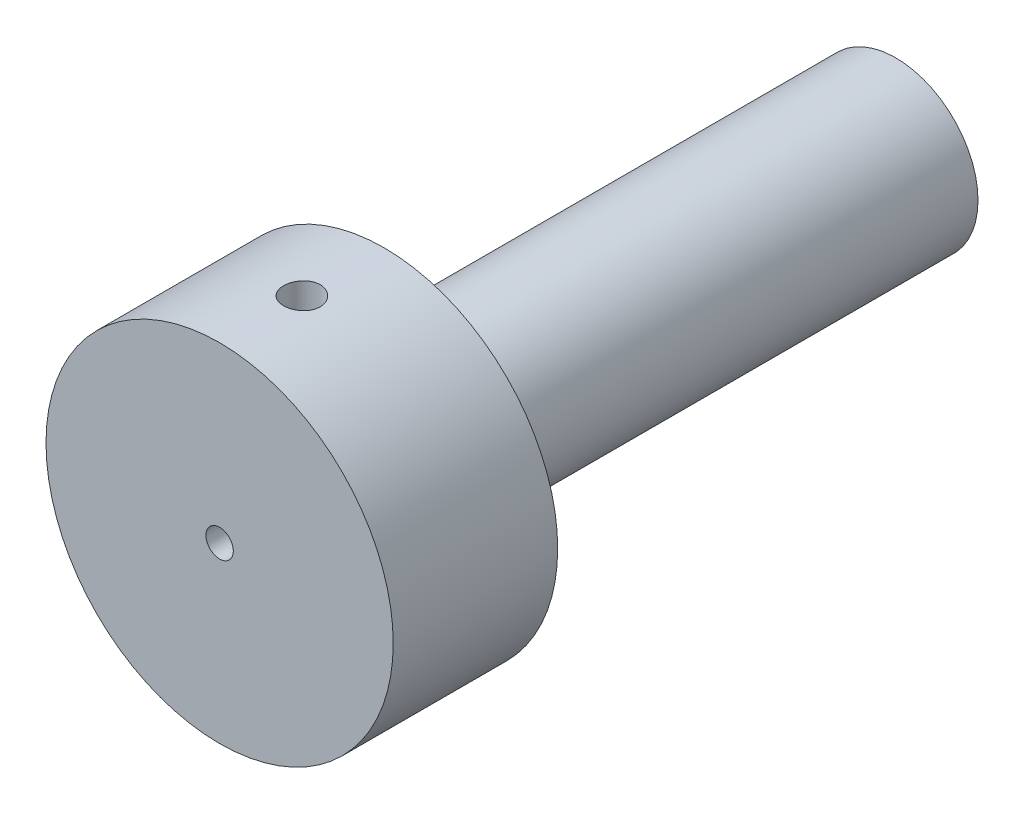
ISO-10303-21;
HEADER;
FILE_DESCRIPTION(('STEP AP214'),'2;1');
FILE_NAME('part.step','',(''),(''),'','','');
FILE_SCHEMA(('AUTOMOTIVE_DESIGN { 1 0 10303 214 1 1 1 1 }'));
ENDSEC;
DATA;
#1=APPLICATION_CONTEXT('core data for automotive mechanical design processes');
#2=APPLICATION_PROTOCOL_DEFINITION('international standard','automotive_design',2000,#1);
#3=PRODUCT_CONTEXT('',#1,'mechanical');
#4=PRODUCT('Part','Part','',(#3));
#5=PRODUCT_RELATED_PRODUCT_CATEGORY('part','',(#4));
#6=PRODUCT_DEFINITION_FORMATION('','',#4);
#7=PRODUCT_DEFINITION_CONTEXT('part definition',#1,'design');
#8=PRODUCT_DEFINITION('design','',#6,#7);
#9=PRODUCT_DEFINITION_SHAPE('','',#8);
#10=(LENGTH_UNIT() NAMED_UNIT(*) SI_UNIT(.MILLI.,.METRE.));
#11=(NAMED_UNIT(*) PLANE_ANGLE_UNIT() SI_UNIT($,.RADIAN.));
#12=(NAMED_UNIT(*) SI_UNIT($,.STERADIAN.) SOLID_ANGLE_UNIT());
#13=UNCERTAINTY_MEASURE_WITH_UNIT(LENGTH_MEASURE(1.E-05),#10,'distance_accuracy_value','');
#14=(GEOMETRIC_REPRESENTATION_CONTEXT(3) GLOBAL_UNCERTAINTY_ASSIGNED_CONTEXT((#13)) GLOBAL_UNIT_ASSIGNED_CONTEXT((#10,
#11,#12)) REPRESENTATION_CONTEXT('',''));
#15=CARTESIAN_POINT('',(0.,0.,0.));
#16=DIRECTION('',(0.,0.,1.));
#17=DIRECTION('',(1.,0.,0.));
#18=AXIS2_PLACEMENT_3D('',#15,#16,#17);
#19=CARTESIAN_POINT('',(-2.22044604925031E-13,19.,56.));
#20=DIRECTION('',(0.,0.,1.));
#21=DIRECTION('',(1.,0.,0.));
#22=AXIS2_PLACEMENT_3D('',#19,#20,#21);
#23=PLANE('',#22);
#24=CARTESIAN_POINT('',(0.,0.,56.));
#25=DIRECTION('',(0.,0.,1.));
#26=DIRECTION('',(1.,0.,0.));
#27=AXIS2_PLACEMENT_3D('',#24,#25,#26);
#28=CIRCLE('',#27,19.);
#29=CARTESIAN_POINT('',(19.,0.,56.));
#30=VERTEX_POINT('',#29);
#31=EDGE_CURVE('E97',#30,#30,#28,.T.);
#32=ORIENTED_EDGE('',*,*,#31,.F.);
#33=EDGE_LOOP('',(#32));
#34=FACE_BOUND('',#33,.T.);
#35=CARTESIAN_POINT('',(0.,0.,56.));
#36=DIRECTION('',(0.,0.,1.));
#37=DIRECTION('',(1.,0.,0.));
#38=AXIS2_PLACEMENT_3D('',#35,#36,#37);
#39=CIRCLE('',#38,12.);
#40=CARTESIAN_POINT('',(12.,0.,56.));
#41=VERTEX_POINT('',#40);
#42=EDGE_CURVE('E100',#41,#41,#39,.T.);
#43=ORIENTED_EDGE('',*,*,#42,.T.);
#44=EDGE_LOOP('',(#43));
#45=FACE_BOUND('',#44,.T.);
#46=CARTESIAN_POINT('',(0.,-15.,56.));
#47=DIRECTION('',(0.,0.,-1.));
#48=DIRECTION('',(-1.,0.,0.));
#49=AXIS2_PLACEMENT_3D('',#46,#47,#48);
#50=CIRCLE('',#49,2.);
#51=CARTESIAN_POINT('',(-2.,-15.,56.));
#52=VERTEX_POINT('',#51);
#53=EDGE_CURVE('E120',#52,#52,#50,.T.);
#54=ORIENTED_EDGE('',*,*,#53,.F.);
#55=EDGE_LOOP('',(#54));
#56=FACE_BOUND('',#55,.T.);
#57=ADVANCED_FACE('F34',(#34,#45,#56),#23,.F.);
#58=CARTESIAN_POINT('',(0.,0.,56.));
#59=DIRECTION('',(0.,0.,1.));
#60=DIRECTION('',(1.,0.,0.));
#61=AXIS2_PLACEMENT_3D('',#58,#59,#60);
#62=CYLINDRICAL_SURFACE('',#61,19.);
#63=ORIENTED_EDGE('',*,*,#31,.T.);
#64=EDGE_LOOP('',(#63));
#65=FACE_BOUND('',#64,.T.);
#66=CARTESIAN_POINT('',(0.,0.,74.));
#67=DIRECTION('',(0.,0.,1.));
#68=DIRECTION('',(1.,0.,0.));
#69=AXIS2_PLACEMENT_3D('',#66,#67,#68);
#70=CIRCLE('',#69,19.);
#71=CARTESIAN_POINT('',(19.,0.,74.));
#72=VERTEX_POINT('',#71);
#73=EDGE_CURVE('E106',#72,#72,#70,.T.);
#74=ORIENTED_EDGE('',*,*,#73,.F.);
#75=EDGE_LOOP('',(#74));
#76=FACE_BOUND('',#75,.T.);
#77=CARTESIAN_POINT('',(-2.22044604925031E-13,19.,63.));
#78=CARTESIAN_POINT('',(-0.11200841784446,18.9999986504858,63.0000048342617));
#79=CARTESIAN_POINT('',(-0.224090111161781,18.9989990230296,63.0094411031933));
#80=CARTESIAN_POINT('',(-0.445143942835877,18.9951074391116,63.046940529852));
#81=CARTESIAN_POINT('',(-0.554112554348689,18.9922134187954,63.0750240033354));
#82=CARTESIAN_POINT('',(-0.765707302443658,18.9848596062168,63.1489892969702));
#83=CARTESIAN_POINT('',(-0.868337309177286,18.9804007807146,63.1948601296548));
#84=CARTESIAN_POINT('',(-1.06441973305336,18.9704154188168,63.3030761623019));
#85=CARTESIAN_POINT('',(-1.15787392189235,18.9648890891521,63.3654181733423));
#86=CARTESIAN_POINT('',(-1.33334438873634,18.9533628684286,63.505072044034));
#87=CARTESIAN_POINT('',(-1.41531912695847,18.9473613745813,63.582435969734));
#88=CARTESIAN_POINT('',(-1.56514654465622,18.9355744197151,63.749826340689));
#89=CARTESIAN_POINT('',(-1.63299855874347,18.9297889688855,63.8398533822287));
#90=CARTESIAN_POINT('',(-1.75280323659812,18.9190729200505,64.0302766054227));
#91=CARTESIAN_POINT('',(-1.8047180252997,18.914144370344,64.1306967413155));
#92=CARTESIAN_POINT('',(-1.89093273887751,18.9057203232874,64.338889775574));
#93=CARTESIAN_POINT('',(-1.92523314323232,18.9022247869301,64.446662473706));
#94=CARTESIAN_POINT('',(-1.97512160268795,18.8970772279925,64.666075990837));
#95=CARTESIAN_POINT('',(-1.99077883849791,18.8954183914399,64.7777009175288));
#96=CARTESIAN_POINT('',(-2.00315040281262,18.8941109684303,65.0020056067457));
#97=CARTESIAN_POINT('',(-1.99986527971551,18.8944623237764,65.1146853386389));
#98=CARTESIAN_POINT('',(-1.97450235288016,18.8971293595455,65.337423187697));
#99=CARTESIAN_POINT('',(-1.95250021241134,18.8994371310551,65.4474900286009));
#100=CARTESIAN_POINT('',(-1.89044560340148,18.9057446232425,65.6623601670323));
#101=CARTESIAN_POINT('',(-1.85039286737185,18.9097443689933,65.7671633865337));
#102=CARTESIAN_POINT('',(-1.75329092276156,18.9189942182592,65.9687695588402));
#103=CARTESIAN_POINT('',(-1.69620827788743,18.924246777425,66.065556290082));
#104=CARTESIAN_POINT('',(-1.56669088681432,18.9354083854364,66.2482045102273));
#105=CARTESIAN_POINT('',(-1.49425564251891,18.9413174555787,66.3340656445184));
#106=CARTESIAN_POINT('',(-1.33566725362244,18.9531615143885,66.4928649694557));
#107=CARTESIAN_POINT('',(-1.24944878844069,18.9590964885675,66.5657379432734));
#108=CARTESIAN_POINT('',(-1.06596783254371,18.9702964129385,66.6959864275575));
#109=CARTESIAN_POINT('',(-0.968705327324457,18.9755613622506,66.753361917671));
#110=CARTESIAN_POINT('',(-0.765851049248126,18.9848300236665,66.8509846495696));
#111=CARTESIAN_POINT('',(-0.660257600031161,18.9888334811183,66.891228433625));
#112=CARTESIAN_POINT('',(-0.443760807693639,18.9951255457873,66.9533968219065));
#113=CARTESIAN_POINT('',(-0.332857640703391,18.9974142098446,66.9753220333392));
#114=CARTESIAN_POINT('',(-0.109454154862558,19.0000115000819,67.0001478206134));
#115=CARTESIAN_POINT('',(0.00303606230905859,19.0003294893725,67.0031383607282));
#116=CARTESIAN_POINT('',(0.226916078947861,18.9989747412679,66.9902464207248));
#117=CARTESIAN_POINT('',(0.338305894892425,18.9973020337271,66.9743642236396));
#118=CARTESIAN_POINT('',(0.556562384347226,18.9921598049335,66.9242523035523));
#119=CARTESIAN_POINT('',(0.663438869422556,18.9886944241164,66.8900648528064));
#120=CARTESIAN_POINT('',(0.869940226842129,18.9803554527278,66.8043564208408));
#121=CARTESIAN_POINT('',(0.969564920006088,18.9754818273755,66.7528350115032));
#122=CARTESIAN_POINT('',(1.15914052129447,18.9648478148886,66.6336991040721));
#123=CARTESIAN_POINT('',(1.24905421057593,18.9590842083916,66.5660256733537));
#124=CARTESIAN_POINT('',(1.41627836777912,18.9473268886043,66.4165910044635));
#125=CARTESIAN_POINT('',(1.49358848438446,18.9413331689054,66.334829373723));
#126=CARTESIAN_POINT('',(1.63372463331238,18.9297628392476,66.1591459388554));
#127=CARTESIAN_POINT('',(1.69649150588133,18.92418799321,66.0651768125406));
#128=CARTESIAN_POINT('',(1.80535237129486,18.9141138909103,65.8679784993518));
#129=CARTESIAN_POINT('',(1.85144661326551,18.9096146185771,65.7647494508702));
#130=CARTESIAN_POINT('',(1.92555535445643,18.9022123156369,65.5521621576928));
#131=CARTESIAN_POINT('',(1.95360469740663,18.8993062103249,65.4428161711808));
#132=CARTESIAN_POINT('',(1.99094032598177,18.8954098830964,65.2209342024658));
#133=CARTESIAN_POINT('',(2.00022721326726,18.8944195997449,65.1083983226713));
#134=CARTESIAN_POINT('',(1.99976544627041,18.8944684327453,64.8839191394379));
#135=CARTESIAN_POINT('',(1.99010972282497,18.8954976416447,64.7719756311244));
#136=CARTESIAN_POINT('',(1.95223204844767,18.8994483350085,64.5513107230277));
#137=CARTESIAN_POINT('',(1.92401007974387,18.9023698212842,64.4425893263288));
#138=CARTESIAN_POINT('',(1.84982735642749,18.9097730829315,64.2314578066699));
#139=CARTESIAN_POINT('',(1.8038696753402,18.9142545879451,64.1290465937453));
#140=CARTESIAN_POINT('',(1.69552954133699,18.92427346405,63.9333762794503));
#141=CARTESIAN_POINT('',(1.63314712244572,18.9298108329541,63.8401171591214));
#142=CARTESIAN_POINT('',(1.49337993384334,18.9413500753827,63.6649221503881));
#143=CARTESIAN_POINT('',(1.41592586926277,18.9473540143885,63.5830416782544));
#144=CARTESIAN_POINT('',(1.24835332858232,18.9591311345796,63.433400654157));
#145=CARTESIAN_POINT('',(1.15823183336845,18.9649042603311,63.3656434778802));
#146=CARTESIAN_POINT('',(0.967607481740541,18.975586079652,63.2460225173412));
#147=CARTESIAN_POINT('',(0.867076685429666,18.9804923457825,63.1942030719495));
#148=CARTESIAN_POINT('',(0.65875157385639,18.9888617207062,63.1082506917677));
#149=CARTESIAN_POINT('',(0.550965545176952,18.9923264445262,63.0740979536469));
#150=CARTESIAN_POINT('',(0.36881580948952,18.9965585235102,63.0328994821718));
#151=CARTESIAN_POINT('',(0.29561370936913,18.9978430079455,63.0205791986967));
#152=CARTESIAN_POINT('',(0.148285110063105,18.9995641909453,63.0041278764855));
#153=CARTESIAN_POINT('',(0.0741586152160444,19.0000008934873,62.9999967993285));
#154=CARTESIAN_POINT('',(-2.22044604925031E-13,19.,63.));
#155=B_SPLINE_CURVE_WITH_KNOTS('',3,(#77,#78,#79,#80,#81,#82,#83,#84,#85,#86,#87,#88,#89,#90,
#91,#92,#93,#94,#95,#96,#97,#98,#99,#100,#101,#102,#103,#104,#105,#106,#107,#108,#109,#110,#111,
#112,#113,#114,#115,#116,#117,#118,#119,#120,#121,#122,#123,#124,#125,#126,#127,#128,#129,#130,
#131,#132,#133,#134,#135,#136,#137,#138,#139,#140,#141,#142,#143,#144,#145,#146,#147,#148,#149,
#150,#151,#152,#153,#154),.UNSPECIFIED.,.T.,.F.,(4,2,2,2,2,2,2,2,2,2,2,2,2,2,2,2,2,2,2,2,2,2,2,
2,2,2,2,2,2,2,2,2,2,2,2,2,2,2,4),(0.,0.335754439352705,0.671875277970141,1.00778882057921,
1.34363737584085,1.68067146079846,2.0177214214343,2.35556629403222,2.69340196971663,
3.0299800650948,3.36654841628658,3.70176262518134,4.03698180171972,4.37286352370221,
4.70875614462732,5.04629056082261,5.38382542030331,5.72142837292332,6.05902013455859,
6.39500668575045,6.73098819823996,7.06619715516565,7.40141439176394,7.73787392755749,
8.07434284033895,8.41215732699429,8.74996676574406,9.08712193908635,9.42426630061441,
9.75976079635821,10.095255613244,10.4306923163605,10.7661283246087,11.103144648226,
11.4402414318414,11.7782677107181,12.1159142565989,12.3382118443412,12.5605083891396),.UNSPECIFIED.);
#156=CARTESIAN_POINT('',(-2.22044604925031E-13,19.,63.));
#157=VERTEX_POINT('',#156);
#158=EDGE_CURVE('E11',#157,#157,#155,.T.);
#159=ORIENTED_EDGE('',*,*,#158,.F.);
#160=EDGE_LOOP('',(#159));
#161=FACE_BOUND('',#160,.T.);
#162=ADVANCED_FACE('F65',(#65,#76,#161),#62,.T.);
#163=CARTESIAN_POINT('',(0.,9.,0.));
#164=DIRECTION('',(0.,0.,1.));
#165=DIRECTION('',(1.,0.,0.));
#166=AXIS2_PLACEMENT_3D('',#163,#164,#165);
#167=PLANE('',#166);
#168=CARTESIAN_POINT('',(0.,0.,0.));
#169=DIRECTION('',(0.,0.,1.));
#170=DIRECTION('',(1.,0.,0.));
#171=AXIS2_PLACEMENT_3D('',#168,#169,#170);
#172=CIRCLE('',#171,9.);
#173=CARTESIAN_POINT('',(9.,0.,0.));
#174=VERTEX_POINT('',#173);
#175=EDGE_CURVE('E46',#174,#174,#172,.T.);
#176=ORIENTED_EDGE('',*,*,#175,.F.);
#177=EDGE_LOOP('',(#176));
#178=FACE_BOUND('',#177,.T.);
#179=CARTESIAN_POINT('',(0.,0.,0.));
#180=DIRECTION('',(0.,0.,1.));
#181=DIRECTION('',(1.,0.,0.));
#182=AXIS2_PLACEMENT_3D('',#179,#180,#181);
#183=CIRCLE('',#182,2.7916748046881);
#184=CARTESIAN_POINT('',(2.7916748046881,0.,0.));
#185=VERTEX_POINT('',#184);
#186=EDGE_CURVE('E91',#185,#185,#183,.T.);
#187=ORIENTED_EDGE('',*,*,#186,.T.);
#188=EDGE_LOOP('',(#187));
#189=FACE_BOUND('',#188,.T.);
#190=ADVANCED_FACE('F71',(#178,#189),#167,.F.);
#191=CARTESIAN_POINT('',(0.,0.,74.));
#192=DIRECTION('',(0.,0.,-1.));
#193=DIRECTION('',(-1.,0.,0.));
#194=AXIS2_PLACEMENT_3D('',#191,#192,#193);
#195=PLANE('',#194);
#196=ORIENTED_EDGE('',*,*,#73,.T.);
#197=EDGE_LOOP('',(#196));
#198=FACE_BOUND('',#197,.T.);
#199=CARTESIAN_POINT('',(0.,0.,74.));
#200=DIRECTION('',(0.,0.,1.));
#201=DIRECTION('',(1.,0.,0.));
#202=AXIS2_PLACEMENT_3D('',#199,#200,#201);
#203=CIRCLE('',#202,1.5);
#204=CARTESIAN_POINT('',(1.5,0.,74.));
#205=VERTEX_POINT('',#204);
#206=EDGE_CURVE('E93',#205,#205,#203,.T.);
#207=ORIENTED_EDGE('',*,*,#206,.F.);
#208=EDGE_LOOP('',(#207));
#209=FACE_BOUND('',#208,.T.);
#210=ADVANCED_FACE('F79',(#198,#209),#195,.F.);
#211=CARTESIAN_POINT('',(0.,0.,0.));
#212=DIRECTION('',(0.,0.,1.));
#213=DIRECTION('',(1.,0.,0.));
#214=AXIS2_PLACEMENT_3D('',#211,#212,#213);
#215=CYLINDRICAL_SURFACE('',#214,9.);
#216=CARTESIAN_POINT('',(0.,0.,53.));
#217=DIRECTION('',(0.,0.,1.));
#218=DIRECTION('',(1.,0.,0.));
#219=AXIS2_PLACEMENT_3D('',#216,#217,#218);
#220=CIRCLE('',#219,9.);
#221=CARTESIAN_POINT('',(9.,0.,53.));
#222=VERTEX_POINT('',#221);
#223=EDGE_CURVE('E118',#222,#222,#220,.T.);
#224=ORIENTED_EDGE('',*,*,#223,.F.);
#225=EDGE_LOOP('',(#224));
#226=FACE_BOUND('',#225,.T.);
#227=ORIENTED_EDGE('',*,*,#175,.T.);
#228=EDGE_LOOP('',(#227));
#229=FACE_BOUND('',#228,.T.);
#230=ADVANCED_FACE('F36',(#226,#229),#215,.T.);
#231=CARTESIAN_POINT('',(0.,0.,0.));
#232=DIRECTION('',(0.,0.,-1.));
#233=DIRECTION('',(-1.,0.,0.));
#234=AXIS2_PLACEMENT_3D('',#231,#232,#233);
#235=CONICAL_SURFACE('',#234,2.7916748046881,0.0174532925199432);
#236=ORIENTED_EDGE('',*,*,#206,.T.);
#237=EDGE_LOOP('',(#236));
#238=FACE_BOUND('',#237,.T.);
#239=ORIENTED_EDGE('',*,*,#186,.F.);
#240=EDGE_LOOP('',(#239));
#241=FACE_BOUND('',#240,.T.);
#242=ADVANCED_FACE('F76',(#238,#241),#235,.F.);
#243=CARTESIAN_POINT('',(-2.22044604925031E-13,19.,65.));
#244=DIRECTION('',(0.,-1.,0.));
#245=DIRECTION('',(0.,0.,-1.));
#246=AXIS2_PLACEMENT_3D('',#243,#244,#245);
#247=CYLINDRICAL_SURFACE('',#246,2.);
#248=CARTESIAN_POINT('',(0.,13.,65.));
#249=DIRECTION('',(0.,-1.,0.));
#250=DIRECTION('',(0.,0.,-1.));
#251=AXIS2_PLACEMENT_3D('',#248,#249,#250);
#252=CIRCLE('',#251,2.);
#253=CARTESIAN_POINT('',(0.,13.,63.));
#254=VERTEX_POINT('',#253);
#255=EDGE_CURVE('E94',#254,#254,#252,.T.);
#256=ORIENTED_EDGE('',*,*,#255,.T.);
#257=EDGE_LOOP('',(#256));
#258=FACE_BOUND('',#257,.T.);
#259=ORIENTED_EDGE('',*,*,#158,.T.);
#260=EDGE_LOOP('',(#259));
#261=FACE_BOUND('',#260,.T.);
#262=ADVANCED_FACE('F114',(#258,#261),#247,.F.);
#263=CARTESIAN_POINT('',(0.,13.,65.));
#264=DIRECTION('',(0.,1.,0.));
#265=DIRECTION('',(0.,0.,1.));
#266=AXIS2_PLACEMENT_3D('',#263,#264,#265);
#267=CONICAL_SURFACE('',#266,2.,1.04719755119659);
#268=CARTESIAN_POINT('',(0.,11.8452994616207,65.));
#269=VERTEX_POINT('',#268);
#270=VERTEX_LOOP('',#269);
#271=FACE_BOUND('',#270,.T.);
#272=ORIENTED_EDGE('',*,*,#255,.F.);
#273=EDGE_LOOP('',(#272));
#274=FACE_BOUND('',#273,.T.);
#275=ADVANCED_FACE('F134',(#271,#274),#267,.F.);
#276=CARTESIAN_POINT('',(0.,0.,53.));
#277=DIRECTION('',(0.,0.,1.));
#278=DIRECTION('',(1.,0.,0.));
#279=AXIS2_PLACEMENT_3D('',#276,#277,#278);
#280=TOROIDAL_SURFACE('',#279,12.,3.);
#281=ORIENTED_EDGE('',*,*,#42,.F.);
#282=EDGE_LOOP('',(#281));
#283=FACE_BOUND('',#282,.T.);
#284=ORIENTED_EDGE('',*,*,#223,.T.);
#285=EDGE_LOOP('',(#284));
#286=FACE_BOUND('',#285,.T.);
#287=ADVANCED_FACE('F60',(#283,#286),#280,.F.);
#288=CARTESIAN_POINT('',(0.,-15.,63.1547005383792));
#289=DIRECTION('',(0.,0.,-1.));
#290=DIRECTION('',(-1.,0.,0.));
#291=AXIS2_PLACEMENT_3D('',#288,#289,#290);
#292=CYLINDRICAL_SURFACE('',#291,2.);
#293=ORIENTED_EDGE('',*,*,#53,.T.);
#294=EDGE_LOOP('',(#293));
#295=FACE_BOUND('',#294,.T.);
#296=CARTESIAN_POINT('',(0.,-15.,62.));
#297=DIRECTION('',(0.,0.,-1.));
#298=DIRECTION('',(-1.,0.,0.));
#299=AXIS2_PLACEMENT_3D('',#296,#297,#298);
#300=CIRCLE('',#299,2.);
#301=CARTESIAN_POINT('',(-2.,-15.,62.));
#302=VERTEX_POINT('',#301);
#303=EDGE_CURVE('E124',#302,#302,#300,.T.);
#304=ORIENTED_EDGE('',*,*,#303,.F.);
#305=EDGE_LOOP('',(#304));
#306=FACE_BOUND('',#305,.T.);
#307=ADVANCED_FACE('F54',(#295,#306),#292,.F.);
#308=CARTESIAN_POINT('',(0.,-15.,63.1547005383792));
#309=DIRECTION('',(0.,0.,-1.));
#310=DIRECTION('',(-1.,0.,0.));
#311=AXIS2_PLACEMENT_3D('',#308,#309,#310);
#312=CONICAL_SURFACE('',#311,0.,1.0471975511966);
#313=ORIENTED_EDGE('',*,*,#303,.T.);
#314=EDGE_LOOP('',(#313));
#315=FACE_BOUND('',#314,.T.);
#316=CARTESIAN_POINT('',(0.,-15.,63.1547005383792));
#317=VERTEX_POINT('',#316);
#318=VERTEX_LOOP('',#317);
#319=FACE_BOUND('',#318,.T.);
#320=ADVANCED_FACE('F52',(#315,#319),#312,.F.);
#321=CLOSED_SHELL('',(#57,#162,#190,#210,#230,#242,#262,#275,#287,#307,#320));
#322=MANIFOLD_SOLID_BREP('B2',#321);
#323=ADVANCED_BREP_SHAPE_REPRESENTATION('',(#18,#322),#14);
#324=SHAPE_DEFINITION_REPRESENTATION(#9,#323);
ENDSEC;
END-ISO-10303-21;
